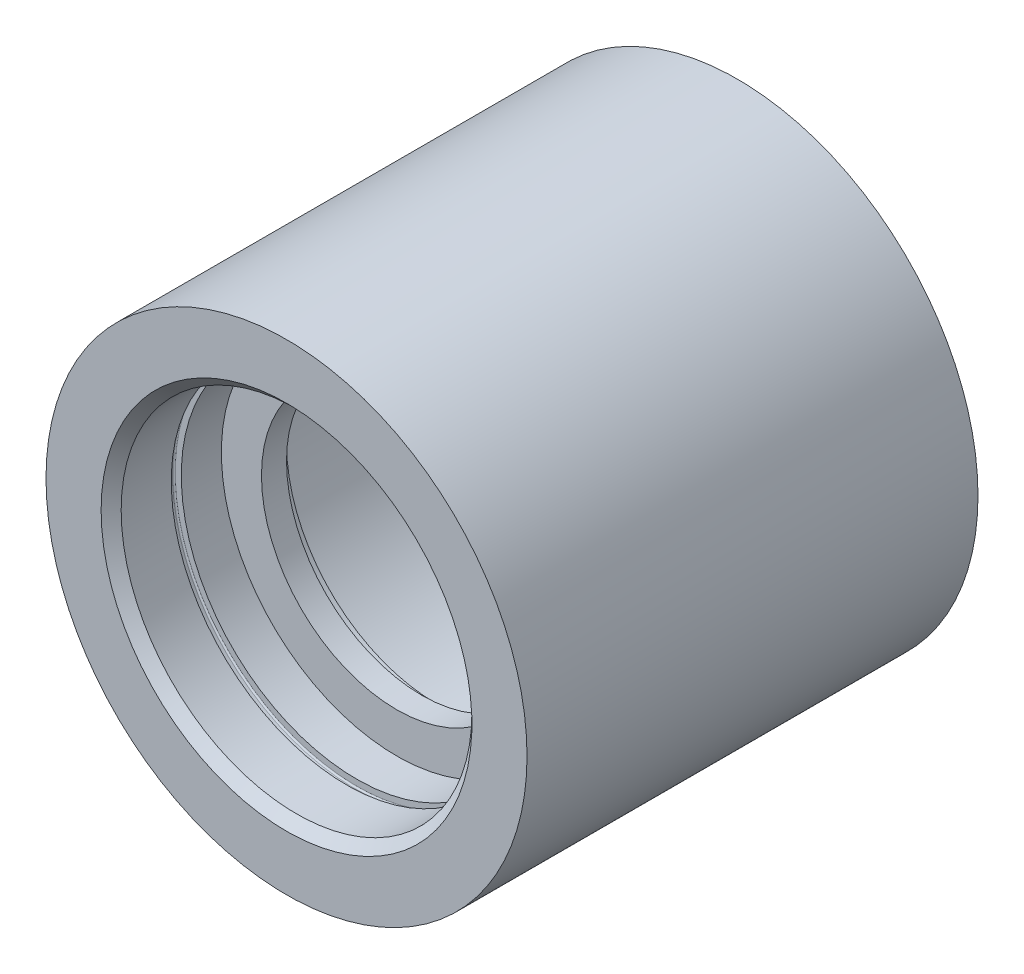
ISO-10303-21;
HEADER;
FILE_DESCRIPTION(('STEP AP214'),'2;1');
FILE_NAME('part.step','',(''),(''),'','','');
FILE_SCHEMA(('AUTOMOTIVE_DESIGN { 1 0 10303 214 1 1 1 1 }'));
ENDSEC;
DATA;
#1=APPLICATION_CONTEXT('core data for automotive mechanical design processes');
#2=APPLICATION_PROTOCOL_DEFINITION('international standard','automotive_design',2000,#1);
#3=PRODUCT_CONTEXT('',#1,'mechanical');
#4=PRODUCT('Part','Part','',(#3));
#5=PRODUCT_RELATED_PRODUCT_CATEGORY('part','',(#4));
#6=PRODUCT_DEFINITION_FORMATION('','',#4);
#7=PRODUCT_DEFINITION_CONTEXT('part definition',#1,'design');
#8=PRODUCT_DEFINITION('design','',#6,#7);
#9=PRODUCT_DEFINITION_SHAPE('','',#8);
#10=(LENGTH_UNIT() NAMED_UNIT(*) SI_UNIT(.MILLI.,.METRE.));
#11=(NAMED_UNIT(*) PLANE_ANGLE_UNIT() SI_UNIT($,.RADIAN.));
#12=(NAMED_UNIT(*) SI_UNIT($,.STERADIAN.) SOLID_ANGLE_UNIT());
#13=UNCERTAINTY_MEASURE_WITH_UNIT(LENGTH_MEASURE(1.E-05),#10,'distance_accuracy_value','');
#14=(GEOMETRIC_REPRESENTATION_CONTEXT(3) GLOBAL_UNCERTAINTY_ASSIGNED_CONTEXT((#13)) GLOBAL_UNIT_ASSIGNED_CONTEXT((#10,
#11,#12)) REPRESENTATION_CONTEXT('',''));
#15=CARTESIAN_POINT('',(0.,0.,0.));
#16=DIRECTION('',(0.,0.,1.));
#17=DIRECTION('',(1.,0.,0.));
#18=AXIS2_PLACEMENT_3D('',#15,#16,#17);
#19=CARTESIAN_POINT('',(0.,0.,0.));
#20=DIRECTION('',(0.,0.,1.));
#21=DIRECTION('',(1.,0.,0.));
#22=AXIS2_PLACEMENT_3D('',#19,#20,#21);
#23=CYLINDRICAL_SURFACE('',#22,40.);
#24=CARTESIAN_POINT('',(0.,1.11022302462516E-13,-29.9999999999998));
#25=DIRECTION('',(0.,0.,1.));
#26=DIRECTION('',(1.,0.,0.));
#27=AXIS2_PLACEMENT_3D('',#24,#25,#26);
#28=CIRCLE('',#27,40.);
#29=CARTESIAN_POINT('',(40.,1.11022302462516E-13,-29.9999999999998));
#30=VERTEX_POINT('',#29);
#31=EDGE_CURVE('E127',#30,#30,#28,.T.);
#32=ORIENTED_EDGE('',*,*,#31,.T.);
#33=EDGE_LOOP('',(#32));
#34=FACE_BOUND('',#33,.T.);
#35=CARTESIAN_POINT('',(0.,0.,-69.0000000000004));
#36=DIRECTION('',(0.,0.,-1.));
#37=DIRECTION('',(-1.,0.,0.));
#38=AXIS2_PLACEMENT_3D('',#35,#36,#37);
#39=CIRCLE('',#38,40.);
#40=CARTESIAN_POINT('',(-40.,0.,-69.0000000000004));
#41=VERTEX_POINT('',#40);
#42=EDGE_CURVE('E108',#41,#41,#39,.F.);
#43=ORIENTED_EDGE('',*,*,#42,.F.);
#44=EDGE_LOOP('',(#43));
#45=FACE_BOUND('',#44,.T.);
#46=ADVANCED_FACE('F43',(#34,#45),#23,.F.);
#47=CARTESIAN_POINT('',(0.,0.,0.));
#48=DIRECTION('',(0.,0.,1.));
#49=DIRECTION('',(1.,0.,0.));
#50=AXIS2_PLACEMENT_3D('',#47,#48,#49);
#51=CYLINDRICAL_SURFACE('',#50,35.);
#52=CARTESIAN_POINT('',(0.,0.,-21.9999999999998));
#53=DIRECTION('',(0.,0.,1.));
#54=DIRECTION('',(1.,0.,0.));
#55=AXIS2_PLACEMENT_3D('',#52,#53,#54);
#56=CIRCLE('',#55,35.);
#57=CARTESIAN_POINT('',(35.,0.,-21.9999999999998));
#58=VERTEX_POINT('',#57);
#59=EDGE_CURVE('E116',#58,#58,#56,.T.);
#60=ORIENTED_EDGE('',*,*,#59,.F.);
#61=EDGE_LOOP('',(#60));
#62=FACE_BOUND('',#61,.T.);
#63=CARTESIAN_POINT('',(0.,-1.11022302462516E-13,-14.0000000000002));
#64=DIRECTION('',(0.,0.,1.));
#65=DIRECTION('',(1.,0.,0.));
#66=AXIS2_PLACEMENT_3D('',#63,#64,#65);
#67=CIRCLE('',#66,35.);
#68=CARTESIAN_POINT('',(35.,-1.11022302462516E-13,-14.0000000000002));
#69=VERTEX_POINT('',#68);
#70=EDGE_CURVE('E107',#69,#69,#67,.F.);
#71=ORIENTED_EDGE('',*,*,#70,.F.);
#72=EDGE_LOOP('',(#71));
#73=FACE_BOUND('',#72,.T.);
#74=ADVANCED_FACE('F154',(#62,#73),#51,.F.);
#75=CARTESIAN_POINT('',(0.,34.9999999999999,0.));
#76=DIRECTION('',(0.,0.,-1.));
#77=DIRECTION('',(-1.,0.,0.));
#78=AXIS2_PLACEMENT_3D('',#75,#76,#77);
#79=PLANE('',#78);
#80=CARTESIAN_POINT('',(0.,0.,0.));
#81=DIRECTION('',(0.,0.,-1.));
#82=DIRECTION('',(-1.,0.,0.));
#83=AXIS2_PLACEMENT_3D('',#80,#81,#82);
#84=CIRCLE('',#83,37.);
#85=CARTESIAN_POINT('',(-37.,0.,0.));
#86=VERTEX_POINT('',#85);
#87=EDGE_CURVE('E10',#86,#86,#84,.T.);
#88=ORIENTED_EDGE('',*,*,#87,.T.);
#89=EDGE_LOOP('',(#88));
#90=FACE_BOUND('',#89,.T.);
#91=CARTESIAN_POINT('',(0.,0.,0.));
#92=DIRECTION('',(0.,0.,1.));
#93=DIRECTION('',(1.,0.,0.));
#94=AXIS2_PLACEMENT_3D('',#91,#92,#93);
#95=CIRCLE('',#94,48.);
#96=CARTESIAN_POINT('',(48.,0.,0.));
#97=VERTEX_POINT('',#96);
#98=EDGE_CURVE('E102',#97,#97,#95,.T.);
#99=ORIENTED_EDGE('',*,*,#98,.T.);
#100=EDGE_LOOP('',(#99));
#101=FACE_BOUND('',#100,.T.);
#102=ADVANCED_FACE('F157',(#90,#101),#79,.F.);
#103=CARTESIAN_POINT('',(0.,0.,0.));
#104=DIRECTION('',(0.,0.,1.));
#105=DIRECTION('',(1.,0.,0.));
#106=AXIS2_PLACEMENT_3D('',#103,#104,#105);
#107=CYLINDRICAL_SURFACE('',#106,48.);
#108=ORIENTED_EDGE('',*,*,#98,.F.);
#109=EDGE_LOOP('',(#108));
#110=FACE_BOUND('',#109,.T.);
#111=CARTESIAN_POINT('',(0.,0.,-90.0000000000003));
#112=DIRECTION('',(0.,0.,1.));
#113=DIRECTION('',(1.,0.,0.));
#114=AXIS2_PLACEMENT_3D('',#111,#112,#113);
#115=CIRCLE('',#114,48.);
#116=CARTESIAN_POINT('',(48.,0.,-90.0000000000003));
#117=VERTEX_POINT('',#116);
#118=EDGE_CURVE('E123',#117,#117,#115,.T.);
#119=ORIENTED_EDGE('',*,*,#118,.T.);
#120=EDGE_LOOP('',(#119));
#121=FACE_BOUND('',#120,.T.);
#122=ADVANCED_FACE('F196',(#110,#121),#107,.T.);
#123=CARTESIAN_POINT('',(0.,48.,-90.0000000000003));
#124=DIRECTION('',(0.,0.,1.));
#125=DIRECTION('',(1.,0.,0.));
#126=AXIS2_PLACEMENT_3D('',#123,#124,#125);
#127=PLANE('',#126);
#128=CARTESIAN_POINT('',(0.,0.,-90.0000000000003));
#129=DIRECTION('',(0.,0.,1.));
#130=DIRECTION('',(1.,0.,0.));
#131=AXIS2_PLACEMENT_3D('',#128,#129,#130);
#132=CIRCLE('',#131,42.);
#133=CARTESIAN_POINT('',(42.,0.,-90.0000000000003));
#134=VERTEX_POINT('',#133);
#135=EDGE_CURVE('E64',#134,#134,#132,.T.);
#136=ORIENTED_EDGE('',*,*,#135,.T.);
#137=EDGE_LOOP('',(#136));
#138=FACE_BOUND('',#137,.T.);
#139=ORIENTED_EDGE('',*,*,#118,.F.);
#140=EDGE_LOOP('',(#139));
#141=FACE_BOUND('',#140,.T.);
#142=ADVANCED_FACE('F188',(#138,#141),#127,.F.);
#143=CARTESIAN_POINT('',(0.,0.,-88.0000000000001));
#144=DIRECTION('',(0.,0.,1.));
#145=DIRECTION('',(1.,0.,0.));
#146=AXIS2_PLACEMENT_3D('',#143,#144,#145);
#147=CIRCLE('',#146,40.);
#148=CARTESIAN_POINT('',(40.,0.,-88.0000000000001));
#149=VERTEX_POINT('',#148);
#150=EDGE_CURVE('E58',#149,#149,#147,.F.);
#151=ORIENTED_EDGE('',*,*,#150,.T.);
#152=EDGE_LOOP('',(#151));
#153=FACE_BOUND('',#152,.T.);
#154=CARTESIAN_POINT('',(0.,0.,-71.2999999999999));
#155=DIRECTION('',(0.,0.,-1.));
#156=DIRECTION('',(-1.,0.,0.));
#157=AXIS2_PLACEMENT_3D('',#154,#155,#156);
#158=CIRCLE('',#157,40.);
#159=CARTESIAN_POINT('',(-40.,0.,-71.2999999999999));
#160=VERTEX_POINT('',#159);
#161=EDGE_CURVE('E103',#160,#160,#158,.F.);
#162=ORIENTED_EDGE('',*,*,#161,.T.);
#163=EDGE_LOOP('',(#162));
#164=FACE_BOUND('',#163,.T.);
#165=ADVANCED_FACE('F180',(#153,#164),#23,.F.);
#166=CARTESIAN_POINT('',(0.,30.0000000000006,-30.0000000000007));
#167=DIRECTION('',(0.,0.,1.));
#168=DIRECTION('',(1.,0.,0.));
#169=AXIS2_PLACEMENT_3D('',#166,#167,#168);
#170=PLANE('',#169);
#171=ORIENTED_EDGE('',*,*,#31,.F.);
#172=EDGE_LOOP('',(#171));
#173=FACE_BOUND('',#172,.T.);
#174=CARTESIAN_POINT('',(0.,1.11022302462516E-13,-29.9999999999998));
#175=DIRECTION('',(0.,0.,1.));
#176=DIRECTION('',(1.,0.,0.));
#177=AXIS2_PLACEMENT_3D('',#174,#175,#176);
#178=CIRCLE('',#177,30.);
#179=CARTESIAN_POINT('',(30.,1.11022302462516E-13,-29.9999999999998));
#180=VERTEX_POINT('',#179);
#181=EDGE_CURVE('E131',#180,#180,#178,.T.);
#182=ORIENTED_EDGE('',*,*,#181,.T.);
#183=EDGE_LOOP('',(#182));
#184=FACE_BOUND('',#183,.T.);
#185=ADVANCED_FACE('F187',(#173,#184),#170,.F.);
#186=CARTESIAN_POINT('',(0.,0.,0.));
#187=DIRECTION('',(0.,0.,1.));
#188=DIRECTION('',(1.,0.,0.));
#189=AXIS2_PLACEMENT_3D('',#186,#187,#188);
#190=CYLINDRICAL_SURFACE('',#189,30.);
#191=ORIENTED_EDGE('',*,*,#181,.F.);
#192=EDGE_LOOP('',(#191));
#193=FACE_BOUND('',#192,.T.);
#194=CARTESIAN_POINT('',(0.,0.,-27.0000000000001));
#195=DIRECTION('',(0.,0.,1.));
#196=DIRECTION('',(1.,0.,0.));
#197=AXIS2_PLACEMENT_3D('',#194,#195,#196);
#198=CIRCLE('',#197,30.);
#199=CARTESIAN_POINT('',(30.,0.,-27.0000000000001));
#200=VERTEX_POINT('',#199);
#201=EDGE_CURVE('E135',#200,#200,#198,.T.);
#202=ORIENTED_EDGE('',*,*,#201,.T.);
#203=EDGE_LOOP('',(#202));
#204=FACE_BOUND('',#203,.T.);
#205=ADVANCED_FACE('F194',(#193,#204),#190,.F.);
#206=CARTESIAN_POINT('',(0.,26.9999999999999,-26.9999999999997));
#207=DIRECTION('',(0.,0.,1.));
#208=DIRECTION('',(1.,0.,0.));
#209=AXIS2_PLACEMENT_3D('',#206,#207,#208);
#210=PLANE('',#209);
#211=ORIENTED_EDGE('',*,*,#201,.F.);
#212=EDGE_LOOP('',(#211));
#213=FACE_BOUND('',#212,.T.);
#214=CARTESIAN_POINT('',(0.,0.,-27.0000000000001));
#215=DIRECTION('',(0.,0.,1.));
#216=DIRECTION('',(1.,0.,0.));
#217=AXIS2_PLACEMENT_3D('',#214,#215,#216);
#218=CIRCLE('',#217,27.);
#219=CARTESIAN_POINT('',(27.,0.,-27.0000000000001));
#220=VERTEX_POINT('',#219);
#221=EDGE_CURVE('E139',#220,#220,#218,.T.);
#222=ORIENTED_EDGE('',*,*,#221,.T.);
#223=EDGE_LOOP('',(#222));
#224=FACE_BOUND('',#223,.T.);
#225=ADVANCED_FACE('F364',(#213,#224),#210,.F.);
#226=CARTESIAN_POINT('',(0.,0.,0.));
#227=DIRECTION('',(0.,0.,1.));
#228=DIRECTION('',(1.,0.,0.));
#229=AXIS2_PLACEMENT_3D('',#226,#227,#228);
#230=CYLINDRICAL_SURFACE('',#229,27.);
#231=ORIENTED_EDGE('',*,*,#221,.F.);
#232=EDGE_LOOP('',(#231));
#233=FACE_BOUND('',#232,.T.);
#234=CARTESIAN_POINT('',(0.,0.,-21.9999999999998));
#235=DIRECTION('',(0.,0.,1.));
#236=DIRECTION('',(1.,0.,0.));
#237=AXIS2_PLACEMENT_3D('',#234,#235,#236);
#238=CIRCLE('',#237,27.);
#239=CARTESIAN_POINT('',(27.,0.,-21.9999999999998));
#240=VERTEX_POINT('',#239);
#241=EDGE_CURVE('E143',#240,#240,#238,.T.);
#242=ORIENTED_EDGE('',*,*,#241,.T.);
#243=EDGE_LOOP('',(#242));
#244=FACE_BOUND('',#243,.T.);
#245=ADVANCED_FACE('F354',(#233,#244),#230,.F.);
#246=CARTESIAN_POINT('',(0.,27.0000000000005,-22.0000000000007));
#247=DIRECTION('',(0.,0.,-1.));
#248=DIRECTION('',(-1.,0.,0.));
#249=AXIS2_PLACEMENT_3D('',#246,#247,#248);
#250=PLANE('',#249);
#251=ORIENTED_EDGE('',*,*,#241,.F.);
#252=EDGE_LOOP('',(#251));
#253=FACE_BOUND('',#252,.T.);
#254=ORIENTED_EDGE('',*,*,#59,.T.);
#255=EDGE_LOOP('',(#254));
#256=FACE_BOUND('',#255,.T.);
#257=ADVANCED_FACE('F152',(#253,#256),#250,.F.);
#258=CARTESIAN_POINT('',(0.,-2.22044604925031E-13,-2.00000000000022));
#259=DIRECTION('',(0.,0.,-1.));
#260=DIRECTION('',(-1.,0.,0.));
#261=AXIS2_PLACEMENT_3D('',#258,#259,#260);
#262=CIRCLE('',#261,35.);
#263=CARTESIAN_POINT('',(-35.,-2.22044604925031E-13,-2.00000000000022));
#264=VERTEX_POINT('',#263);
#265=EDGE_CURVE('E52',#264,#264,#262,.F.);
#266=ORIENTED_EDGE('',*,*,#265,.T.);
#267=EDGE_LOOP('',(#266));
#268=FACE_BOUND('',#267,.T.);
#269=CARTESIAN_POINT('',(0.,-3.33066907387547E-13,-12.));
#270=DIRECTION('',(0.,0.,1.));
#271=DIRECTION('',(1.,0.,0.));
#272=AXIS2_PLACEMENT_3D('',#269,#270,#271);
#273=CIRCLE('',#272,35.);
#274=CARTESIAN_POINT('',(35.,-3.33066907387547E-13,-12.));
#275=VERTEX_POINT('',#274);
#276=EDGE_CURVE('E112',#275,#275,#273,.F.);
#277=ORIENTED_EDGE('',*,*,#276,.T.);
#278=EDGE_LOOP('',(#277));
#279=FACE_BOUND('',#278,.T.);
#280=ADVANCED_FACE('F159',(#268,#279),#51,.F.);
#281=CARTESIAN_POINT('',(0.,-3.33066907387547E-13,-12.));
#282=DIRECTION('',(0.,0.,1.));
#283=DIRECTION('',(1.,0.,0.));
#284=AXIS2_PLACEMENT_3D('',#281,#282,#283);
#285=PLANE('',#284);
#286=CARTESIAN_POINT('',(0.,-3.33066907387547E-13,-12.));
#287=DIRECTION('',(0.,0.,1.));
#288=DIRECTION('',(1.,0.,0.));
#289=AXIS2_PLACEMENT_3D('',#286,#287,#288);
#290=CIRCLE('',#289,36.2);
#291=CARTESIAN_POINT('',(36.2,-3.33066907387547E-13,-12.));
#292=VERTEX_POINT('',#291);
#293=EDGE_CURVE('E74',#292,#292,#290,.F.);
#294=ORIENTED_EDGE('',*,*,#293,.T.);
#295=EDGE_LOOP('',(#294));
#296=FACE_BOUND('',#295,.T.);
#297=ORIENTED_EDGE('',*,*,#276,.F.);
#298=EDGE_LOOP('',(#297));
#299=FACE_BOUND('',#298,.T.);
#300=ADVANCED_FACE('F165',(#296,#299),#285,.F.);
#301=CARTESIAN_POINT('',(0.,-1.11022302462516E-13,-14.0000000000002));
#302=DIRECTION('',(0.,0.,1.));
#303=DIRECTION('',(1.,0.,0.));
#304=AXIS2_PLACEMENT_3D('',#301,#302,#303);
#305=PLANE('',#304);
#306=CARTESIAN_POINT('',(0.,-1.11022302462516E-13,-14.0000000000002));
#307=DIRECTION('',(0.,0.,1.));
#308=DIRECTION('',(1.,0.,0.));
#309=AXIS2_PLACEMENT_3D('',#306,#307,#308);
#310=CIRCLE('',#309,36.2);
#311=CARTESIAN_POINT('',(36.2,-1.11022302462516E-13,-14.0000000000002));
#312=VERTEX_POINT('',#311);
#313=EDGE_CURVE('E70',#312,#312,#310,.T.);
#314=ORIENTED_EDGE('',*,*,#313,.T.);
#315=EDGE_LOOP('',(#314));
#316=FACE_BOUND('',#315,.T.);
#317=ORIENTED_EDGE('',*,*,#70,.T.);
#318=EDGE_LOOP('',(#317));
#319=FACE_BOUND('',#318,.T.);
#320=ADVANCED_FACE('F162',(#316,#319),#305,.T.);
#321=CARTESIAN_POINT('',(0.,-3.33066907387547E-13,-12.));
#322=DIRECTION('',(0.,0.,-1.));
#323=DIRECTION('',(-1.,0.,0.));
#324=AXIS2_PLACEMENT_3D('',#321,#322,#323);
#325=CYLINDRICAL_SURFACE('',#324,36.5);
#326=CARTESIAN_POINT('',(0.,1.11022302462516E-13,-12.3000000000002));
#327=DIRECTION('',(0.,0.,1.));
#328=DIRECTION('',(1.,0.,0.));
#329=AXIS2_PLACEMENT_3D('',#326,#327,#328);
#330=CIRCLE('',#329,36.5);
#331=CARTESIAN_POINT('',(36.5,1.11022302462516E-13,-12.3000000000002));
#332=VERTEX_POINT('',#331);
#333=EDGE_CURVE('E78',#332,#332,#330,.T.);
#334=ORIENTED_EDGE('',*,*,#333,.T.);
#335=EDGE_LOOP('',(#334));
#336=FACE_BOUND('',#335,.T.);
#337=CARTESIAN_POINT('',(0.,-1.11022302462516E-13,-13.7));
#338=DIRECTION('',(0.,0.,1.));
#339=DIRECTION('',(1.,0.,0.));
#340=AXIS2_PLACEMENT_3D('',#337,#338,#339);
#341=CIRCLE('',#340,36.5);
#342=CARTESIAN_POINT('',(36.5,-1.11022302462516E-13,-13.7));
#343=VERTEX_POINT('',#342);
#344=EDGE_CURVE('E82',#343,#343,#341,.F.);
#345=ORIENTED_EDGE('',*,*,#344,.T.);
#346=EDGE_LOOP('',(#345));
#347=FACE_BOUND('',#346,.T.);
#348=ADVANCED_FACE('F164',(#336,#347),#325,.F.);
#349=CARTESIAN_POINT('',(0.,0.,-71.2999999999999));
#350=DIRECTION('',(0.,0.,-1.));
#351=DIRECTION('',(-1.,0.,0.));
#352=AXIS2_PLACEMENT_3D('',#349,#350,#351);
#353=PLANE('',#352);
#354=CARTESIAN_POINT('',(0.,0.,-71.2999999999999));
#355=DIRECTION('',(0.,0.,-1.));
#356=DIRECTION('',(-1.,0.,0.));
#357=AXIS2_PLACEMENT_3D('',#354,#355,#356);
#358=CIRCLE('',#357,41.45);
#359=CARTESIAN_POINT('',(-41.45,0.,-71.2999999999999));
#360=VERTEX_POINT('',#359);
#361=EDGE_CURVE('E90',#360,#360,#358,.F.);
#362=ORIENTED_EDGE('',*,*,#361,.T.);
#363=EDGE_LOOP('',(#362));
#364=FACE_BOUND('',#363,.T.);
#365=ORIENTED_EDGE('',*,*,#161,.F.);
#366=EDGE_LOOP('',(#365));
#367=FACE_BOUND('',#366,.T.);
#368=ADVANCED_FACE('F172',(#364,#367),#353,.F.);
#369=CARTESIAN_POINT('',(0.,0.,-69.0000000000004));
#370=DIRECTION('',(0.,0.,-1.));
#371=DIRECTION('',(-1.,0.,0.));
#372=AXIS2_PLACEMENT_3D('',#369,#370,#371);
#373=PLANE('',#372);
#374=CARTESIAN_POINT('',(0.,0.,-69.0000000000004));
#375=DIRECTION('',(0.,0.,-1.));
#376=DIRECTION('',(-1.,0.,0.));
#377=AXIS2_PLACEMENT_3D('',#374,#375,#376);
#378=CIRCLE('',#377,41.45);
#379=CARTESIAN_POINT('',(-41.45,0.,-69.0000000000004));
#380=VERTEX_POINT('',#379);
#381=EDGE_CURVE('E86',#380,#380,#378,.T.);
#382=ORIENTED_EDGE('',*,*,#381,.T.);
#383=EDGE_LOOP('',(#382));
#384=FACE_BOUND('',#383,.T.);
#385=ORIENTED_EDGE('',*,*,#42,.T.);
#386=EDGE_LOOP('',(#385));
#387=FACE_BOUND('',#386,.T.);
#388=ADVANCED_FACE('F203',(#384,#387),#373,.T.);
#389=CARTESIAN_POINT('',(0.,0.,-71.2999999999999));
#390=DIRECTION('',(0.,0.,1.));
#391=DIRECTION('',(1.,0.,0.));
#392=AXIS2_PLACEMENT_3D('',#389,#390,#391);
#393=CYLINDRICAL_SURFACE('',#392,41.75);
#394=CARTESIAN_POINT('',(0.,1.11022302462516E-13,-71.0000000000002));
#395=DIRECTION('',(0.,0.,-1.));
#396=DIRECTION('',(-1.,0.,0.));
#397=AXIS2_PLACEMENT_3D('',#394,#395,#396);
#398=CIRCLE('',#397,41.75);
#399=CARTESIAN_POINT('',(-41.75,1.11022302462516E-13,-71.0000000000002));
#400=VERTEX_POINT('',#399);
#401=EDGE_CURVE('E94',#400,#400,#398,.T.);
#402=ORIENTED_EDGE('',*,*,#401,.T.);
#403=EDGE_LOOP('',(#402));
#404=FACE_BOUND('',#403,.T.);
#405=CARTESIAN_POINT('',(0.,-1.11022302462516E-13,-69.3000000000001));
#406=DIRECTION('',(0.,0.,-1.));
#407=DIRECTION('',(-1.,0.,0.));
#408=AXIS2_PLACEMENT_3D('',#405,#406,#407);
#409=CIRCLE('',#408,41.75);
#410=CARTESIAN_POINT('',(-41.75,-1.11022302462516E-13,-69.3000000000001));
#411=VERTEX_POINT('',#410);
#412=EDGE_CURVE('E98',#411,#411,#409,.F.);
#413=ORIENTED_EDGE('',*,*,#412,.T.);
#414=EDGE_LOOP('',(#413));
#415=FACE_BOUND('',#414,.T.);
#416=ADVANCED_FACE('F209',(#404,#415),#393,.F.);
#417=CARTESIAN_POINT('',(0.,1.11022302462516E-13,-71.0000000000002));
#418=DIRECTION('',(0.,0.,-1.));
#419=DIRECTION('',(-1.,0.,0.));
#420=AXIS2_PLACEMENT_3D('',#417,#418,#419);
#421=TOROIDAL_SURFACE('',#420,41.45,0.3);
#422=ORIENTED_EDGE('',*,*,#361,.F.);
#423=EDGE_LOOP('',(#422));
#424=FACE_BOUND('',#423,.T.);
#425=ORIENTED_EDGE('',*,*,#401,.F.);
#426=EDGE_LOOP('',(#425));
#427=FACE_BOUND('',#426,.T.);
#428=ADVANCED_FACE('F214',(#424,#427),#421,.F.);
#429=CARTESIAN_POINT('',(0.,-1.11022302462516E-13,-69.3000000000001));
#430=DIRECTION('',(0.,0.,-1.));
#431=DIRECTION('',(-1.,0.,0.));
#432=AXIS2_PLACEMENT_3D('',#429,#430,#431);
#433=TOROIDAL_SURFACE('',#432,41.45,0.3);
#434=ORIENTED_EDGE('',*,*,#412,.F.);
#435=EDGE_LOOP('',(#434));
#436=FACE_BOUND('',#435,.T.);
#437=ORIENTED_EDGE('',*,*,#381,.F.);
#438=EDGE_LOOP('',(#437));
#439=FACE_BOUND('',#438,.T.);
#440=ADVANCED_FACE('F219',(#436,#439),#433,.F.);
#441=CARTESIAN_POINT('',(0.,1.11022302462516E-13,-12.3000000000002));
#442=DIRECTION('',(0.,0.,1.));
#443=DIRECTION('',(1.,0.,0.));
#444=AXIS2_PLACEMENT_3D('',#441,#442,#443);
#445=TOROIDAL_SURFACE('',#444,36.2,0.3);
#446=ORIENTED_EDGE('',*,*,#293,.F.);
#447=EDGE_LOOP('',(#446));
#448=FACE_BOUND('',#447,.T.);
#449=ORIENTED_EDGE('',*,*,#333,.F.);
#450=EDGE_LOOP('',(#449));
#451=FACE_BOUND('',#450,.T.);
#452=ADVANCED_FACE('F228',(#448,#451),#445,.F.);
#453=CARTESIAN_POINT('',(0.,-1.11022302462516E-13,-13.7));
#454=DIRECTION('',(0.,0.,1.));
#455=DIRECTION('',(1.,0.,0.));
#456=AXIS2_PLACEMENT_3D('',#453,#454,#455);
#457=TOROIDAL_SURFACE('',#456,36.2,0.3);
#458=ORIENTED_EDGE('',*,*,#344,.F.);
#459=EDGE_LOOP('',(#458));
#460=FACE_BOUND('',#459,.T.);
#461=ORIENTED_EDGE('',*,*,#313,.F.);
#462=EDGE_LOOP('',(#461));
#463=FACE_BOUND('',#462,.T.);
#464=ADVANCED_FACE('F236',(#460,#463),#457,.F.);
#465=CARTESIAN_POINT('',(0.,0.,-90.0000000000003));
#466=DIRECTION('',(0.,0.,-1.));
#467=DIRECTION('',(-1.,0.,0.));
#468=AXIS2_PLACEMENT_3D('',#465,#466,#467);
#469=CONICAL_SURFACE('',#468,42.,0.785398163397448);
#470=ORIENTED_EDGE('',*,*,#150,.F.);
#471=EDGE_LOOP('',(#470));
#472=FACE_BOUND('',#471,.T.);
#473=ORIENTED_EDGE('',*,*,#135,.F.);
#474=EDGE_LOOP('',(#473));
#475=FACE_BOUND('',#474,.T.);
#476=ADVANCED_FACE('F242',(#472,#475),#469,.F.);
#477=CARTESIAN_POINT('',(0.,-2.22044604925031E-13,-2.00000000000022));
#478=DIRECTION('',(0.,0.,1.));
#479=DIRECTION('',(1.,0.,0.));
#480=AXIS2_PLACEMENT_3D('',#477,#478,#479);
#481=CONICAL_SURFACE('',#480,35.,0.785398163397448);
#482=ORIENTED_EDGE('',*,*,#87,.F.);
#483=EDGE_LOOP('',(#482));
#484=FACE_BOUND('',#483,.T.);
#485=ORIENTED_EDGE('',*,*,#265,.F.);
#486=EDGE_LOOP('',(#485));
#487=FACE_BOUND('',#486,.T.);
#488=ADVANCED_FACE('F46',(#484,#487),#481,.F.);
#489=CLOSED_SHELL('',(#46,#74,#102,#122,#142,#165,#185,#205,#225,#245,#257,#280,#300,#320,#348,
#368,#388,#416,#428,#440,#452,#464,#476,#488));
#490=MANIFOLD_SOLID_BREP('B2',#489);
#491=ADVANCED_BREP_SHAPE_REPRESENTATION('',(#18,#490),#14);
#492=SHAPE_DEFINITION_REPRESENTATION(#9,#491);
ENDSEC;
END-ISO-10303-21;
